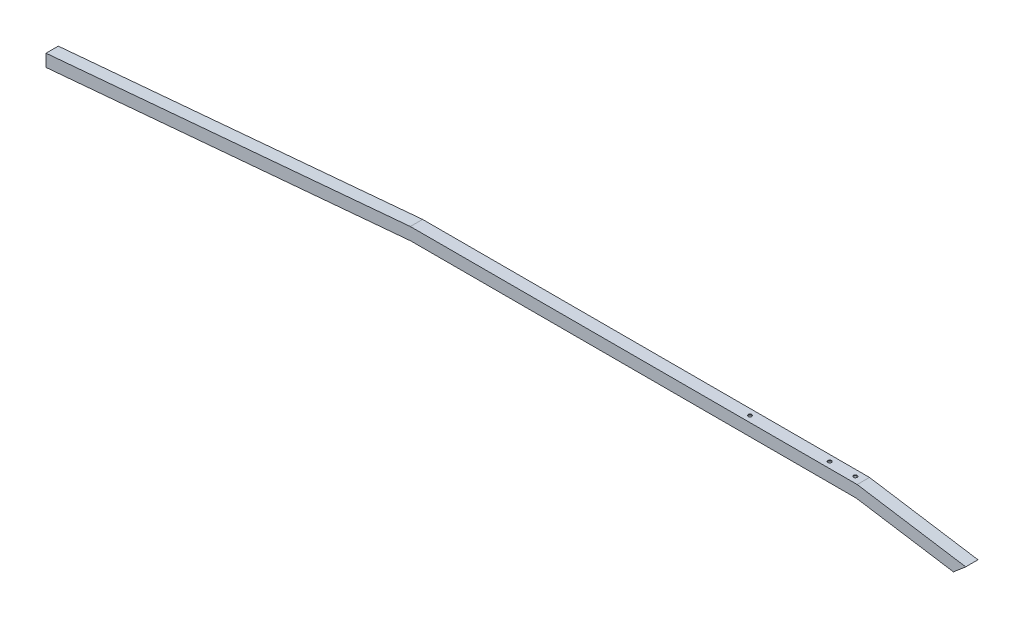
ISO-10303-21;
HEADER;
FILE_DESCRIPTION(('STEP AP214'),'2;1');
FILE_NAME('part.step','',(''),(''),'','','');
FILE_SCHEMA(('AUTOMOTIVE_DESIGN { 1 0 10303 214 1 1 1 1 }'));
ENDSEC;
DATA;
#1=APPLICATION_CONTEXT('core data for automotive mechanical design processes');
#2=APPLICATION_PROTOCOL_DEFINITION('international standard','automotive_design',2000,#1);
#3=PRODUCT_CONTEXT('',#1,'mechanical');
#4=PRODUCT('Part','Part','',(#3));
#5=PRODUCT_RELATED_PRODUCT_CATEGORY('part','',(#4));
#6=PRODUCT_DEFINITION_FORMATION('','',#4);
#7=PRODUCT_DEFINITION_CONTEXT('part definition',#1,'design');
#8=PRODUCT_DEFINITION('design','',#6,#7);
#9=PRODUCT_DEFINITION_SHAPE('','',#8);
#10=(LENGTH_UNIT() NAMED_UNIT(*) SI_UNIT(.MILLI.,.METRE.));
#11=(NAMED_UNIT(*) PLANE_ANGLE_UNIT() SI_UNIT($,.RADIAN.));
#12=(NAMED_UNIT(*) SI_UNIT($,.STERADIAN.) SOLID_ANGLE_UNIT());
#13=UNCERTAINTY_MEASURE_WITH_UNIT(LENGTH_MEASURE(1.E-05),#10,'distance_accuracy_value','');
#14=(GEOMETRIC_REPRESENTATION_CONTEXT(3) GLOBAL_UNCERTAINTY_ASSIGNED_CONTEXT((#13)) GLOBAL_UNIT_ASSIGNED_CONTEXT((#10,
#11,#12)) REPRESENTATION_CONTEXT('',''));
#15=CARTESIAN_POINT('',(0.,0.,0.));
#16=DIRECTION('',(0.,0.,1.));
#17=DIRECTION('',(1.,0.,0.));
#18=AXIS2_PLACEMENT_3D('',#15,#16,#17);
#19=CARTESIAN_POINT('',(0.,0.,-1.651));
#20=DIRECTION('',(0.,0.,-1.));
#21=DIRECTION('',(-1.,0.,0.));
#22=AXIS2_PLACEMENT_3D('',#19,#20,#21);
#23=PLANE('',#22);
#24=DIRECTION('',(-0.987869503710143,0.155286327921928,0.));
#25=VECTOR('',#24,1.);
#26=CARTESIAN_POINT('',(1885.49818551755,76.3667036237448,-1.651));
#27=LINE('',#26,#25);
#28=CARTESIAN_POINT('',(2113.01887833384,40.6020071926856,-1.651));
#29=VERTEX_POINT('',#28);
#30=CARTESIAN_POINT('',(1885.37077889561,76.3867310731194,-1.651));
#31=VERTEX_POINT('',#30);
#32=EDGE_CURVE('E428',#29,#31,#27,.T.);
#33=ORIENTED_EDGE('',*,*,#32,.T.);
#34=DIRECTION('',(-1.,0.,0.));
#35=VECTOR('',#34,1.);
#36=CARTESIAN_POINT('',(848.876766402868,76.3867310731194,-1.651));
#37=LINE('',#36,#35);
#38=CARTESIAN_POINT('',(848.804662659476,76.3867310731194,-1.651));
#39=VERTEX_POINT('',#38);
#40=EDGE_CURVE('E419',#31,#39,#37,.T.);
#41=ORIENTED_EDGE('',*,*,#40,.T.);
#42=DIRECTION('',(-0.996148926897728,-0.0876773370974782,0.));
#43=VECTOR('',#42,1.);
#44=CARTESIAN_POINT('',(847.242528202121,76.2492377870146,-1.651));
#45=LINE('',#44,#43);
#46=CARTESIAN_POINT('',(847.242528202121,76.2492377870146,-1.651));
#47=VERTEX_POINT('',#46);
#48=EDGE_CURVE('E193',#39,#47,#45,.T.);
#49=ORIENTED_EDGE('',*,*,#48,.T.);
#50=DIRECTION('',(-0.996146800530288,-0.0877014925373072,0.));
#51=VECTOR('',#50,1.);
#52=CARTESIAN_POINT('',(847.242528202121,76.2492377870146,-1.651));
#53=LINE('',#52,#51);
#54=CARTESIAN_POINT('',(0.,1.65738623978023,-1.651));
#55=VERTEX_POINT('',#54);
#56=EDGE_CURVE('E191',#47,#55,#53,.T.);
#57=ORIENTED_EDGE('',*,*,#56,.T.);
#58=DIRECTION('',(0.,1.,0.));
#59=VECTOR('',#58,1.);
#60=CARTESIAN_POINT('',(0.,28.6855310731194,-1.651));
#61=LINE('',#60,#59);
#62=CARTESIAN_POINT('',(0.,27.0281448333392,-1.651));
#63=VERTEX_POINT('',#62);
#64=EDGE_CURVE('E9',#55,#63,#61,.T.);
#65=ORIENTED_EDGE('',*,*,#64,.T.);
#66=DIRECTION('',(0.996146800530287,0.0877014925373134,0.));
#67=VECTOR('',#66,1.);
#68=CARTESIAN_POINT('',(0.382685900216284,27.0618367797512,-1.651));
#69=LINE('',#68,#67);
#70=CARTESIAN_POINT('',(847.693849903717,101.659731073119,-1.651));
#71=VERTEX_POINT('',#70);
#72=EDGE_CURVE('E198',#63,#71,#69,.T.);
#73=ORIENTED_EDGE('',*,*,#72,.T.);
#74=DIRECTION('',(1.,0.,0.));
#75=VECTOR('',#74,1.);
#76=CARTESIAN_POINT('',(847.693849903717,101.659731073119,-1.651));
#77=LINE('',#76,#75);
#78=CARTESIAN_POINT('',(1887.34502889454,101.659731073119,-1.651));
#79=VERTEX_POINT('',#78);
#80=EDGE_CURVE('E423',#71,#79,#77,.T.);
#81=ORIENTED_EDGE('',*,*,#80,.T.);
#82=DIRECTION('',(0.987869503710094,-0.155286327922236,0.));
#83=VECTOR('',#82,1.);
#84=CARTESIAN_POINT('',(1887.34502889454,101.659731073119,-1.651));
#85=LINE('',#84,#83);
#86=CARTESIAN_POINT('',(2138.29856329405,62.2115522502588,-1.651));
#87=VERTEX_POINT('',#86);
#88=EDGE_CURVE('E30',#79,#87,#85,.T.);
#89=ORIENTED_EDGE('',*,*,#88,.T.);
#90=DIRECTION('',(0.760128891971908,0.649772319808684,0.));
#91=VECTOR('',#90,1.);
#92=CARTESIAN_POINT('',(872.071398984402,-1020.18298721248,-1.651));
#93=LINE('',#92,#91);
#94=EDGE_CURVE('E23',#29,#87,#93,.T.);
#95=ORIENTED_EDGE('',*,*,#94,.F.);
#96=EDGE_LOOP('',(#33,#41,#49,#57,#65,#73,#81,#89,#95));
#97=FACE_BOUND('',#96,.T.);
#98=ADVANCED_FACE('F15',(#97),#23,.T.);
#99=CARTESIAN_POINT('',(2.50607014925375,0.220636247966421,-28.575));
#100=DIRECTION('',(-0.0877014925373127,0.996146800530287,0.));
#101=DIRECTION('',(-0.996146800530287,-0.0877014925373127,0.));
#102=AXIS2_PLACEMENT_3D('',#99,#100,#101);
#103=PLANE('',#102);
#104=DIRECTION('',(-0.996146800530287,-0.0877014925373127,0.));
#105=VECTOR('',#104,1.);
#106=CARTESIAN_POINT('',(2.50607014925375,0.220636247966421,0.));
#107=LINE('',#106,#105);
#108=CARTESIAN_POINT('',(848.876766402868,74.7357310731194,0.));
#109=VERTEX_POINT('',#108);
#110=CARTESIAN_POINT('',(0.,0.,0.));
#111=VERTEX_POINT('',#110);
#112=EDGE_CURVE('E229',#109,#111,#107,.T.);
#113=ORIENTED_EDGE('',*,*,#112,.T.);
#114=DIRECTION('',(0.,0.,1.));
#115=VECTOR('',#114,1.);
#116=CARTESIAN_POINT('',(0.,0.,-28.575));
#117=LINE('',#116,#115);
#118=CARTESIAN_POINT('',(0.,0.,-28.575));
#119=VERTEX_POINT('',#118);
#120=EDGE_CURVE('E226',#119,#111,#117,.T.);
#121=ORIENTED_EDGE('',*,*,#120,.F.);
#122=DIRECTION('',(-0.996146800530287,-0.0877014925373135,0.));
#123=VECTOR('',#122,1.);
#124=CARTESIAN_POINT('',(13.2669580464314,1.16803268502449,-28.575));
#125=LINE('',#124,#123);
#126=CARTESIAN_POINT('',(848.876766402868,74.7357310731194,-28.575));
#127=VERTEX_POINT('',#126);
#128=EDGE_CURVE('E224',#127,#119,#125,.T.);
#129=ORIENTED_EDGE('',*,*,#128,.F.);
#130=DIRECTION('',(0.,0.,1.));
#131=VECTOR('',#130,1.);
#132=CARTESIAN_POINT('',(848.876766402868,74.7357310731194,-28.575));
#133=LINE('',#132,#131);
#134=EDGE_CURVE('E254',#127,#109,#133,.T.);
#135=ORIENTED_EDGE('',*,*,#134,.T.);
#136=EDGE_LOOP('',(#113,#121,#129,#135));
#137=FACE_BOUND('',#136,.T.);
#138=DIRECTION('',(-0.996146800530287,-0.0877014925373135,0.));
#139=VECTOR('',#138,1.);
#140=CARTESIAN_POINT('',(697.506781254888,61.4090069238654,-19.3972620537415));
#141=LINE('',#140,#139);
#142=CARTESIAN_POINT('',(697.506781254888,61.4090069238651,-19.3972620537415));
#143=VERTEX_POINT('',#142);
#144=CARTESIAN_POINT('',(685.235248819155,60.3286122372982,-19.3972620537415));
#145=VERTEX_POINT('',#144);
#146=EDGE_CURVE('E38',#143,#145,#141,.T.);
#147=ORIENTED_EDGE('',*,*,#146,.T.);
#148=CARTESIAN_POINT('',(685.235248819155,60.3286122372982,-13.4917620537415));
#149=DIRECTION('',(-0.0877014925373135,0.996146800530287,0.));
#150=DIRECTION('',(0.996146800530287,0.0877014925373135,0.));
#151=AXIS2_PLACEMENT_3D('',#148,#149,#150);
#152=CIRCLE('',#151,5.9055);
#153=CARTESIAN_POINT('',(685.235248819155,60.3286122372982,-7.58626205374153));
#154=VERTEX_POINT('',#153);
#155=EDGE_CURVE('E333',#145,#154,#152,.T.);
#156=ORIENTED_EDGE('',*,*,#155,.T.);
#157=DIRECTION('',(0.996146800530287,0.0877014925373135,0.));
#158=VECTOR('',#157,1.);
#159=CARTESIAN_POINT('',(685.235248819155,60.3286122372982,-7.58626205374153));
#160=LINE('',#159,#158);
#161=CARTESIAN_POINT('',(697.506781254888,61.4090069238654,-7.58626205374153));
#162=VERTEX_POINT('',#161);
#163=EDGE_CURVE('E337',#154,#162,#160,.T.);
#164=ORIENTED_EDGE('',*,*,#163,.T.);
#165=CARTESIAN_POINT('',(697.506781254888,61.4090069238654,-13.4917620537415));
#166=DIRECTION('',(-0.0877014925373135,0.996146800530287,0.));
#167=DIRECTION('',(-0.996146800530287,-0.0877014925373135,0.));
#168=AXIS2_PLACEMENT_3D('',#165,#166,#167);
#169=CIRCLE('',#168,5.9055);
#170=EDGE_CURVE('E341',#162,#143,#169,.T.);
#171=ORIENTED_EDGE('',*,*,#170,.T.);
#172=EDGE_LOOP('',(#147,#156,#164,#171));
#173=FACE_BOUND('',#172,.T.);
#174=ADVANCED_FACE('F482',(#137,#173),#103,.F.);
#175=CARTESIAN_POINT('',(847.242528202121,76.2492377870146,-26.9835241074831));
#176=DIRECTION('',(-0.0877014925373072,0.996146800530288,0.));
#177=DIRECTION('',(-0.996146800530288,-0.0877014925373072,0.));
#178=AXIS2_PLACEMENT_3D('',#175,#176,#177);
#179=PLANE('',#178);
#180=ORIENTED_EDGE('',*,*,#56,.F.);
#181=DIRECTION('',(0.,0.,1.));
#182=VECTOR('',#181,1.);
#183=CARTESIAN_POINT('',(847.242528202121,76.2492377870146,-26.9835241074831));
#184=LINE('',#183,#182);
#185=CARTESIAN_POINT('',(847.242528202121,76.2492377870146,-26.9835241074831));
#186=VERTEX_POINT('',#185);
#187=EDGE_CURVE('E204',#186,#47,#184,.T.);
#188=ORIENTED_EDGE('',*,*,#187,.F.);
#189=DIRECTION('',(-0.996146800530288,-0.0877014925373072,0.));
#190=VECTOR('',#189,1.);
#191=CARTESIAN_POINT('',(847.242528202121,76.2492377870146,-26.9835241074831));
#192=LINE('',#191,#190);
#193=CARTESIAN_POINT('',(0.,1.65738623978023,-26.9835241074831));
#194=VERTEX_POINT('',#193);
#195=EDGE_CURVE('E202',#186,#194,#192,.T.);
#196=ORIENTED_EDGE('',*,*,#195,.T.);
#197=DIRECTION('',(0.,0.,1.));
#198=VECTOR('',#197,1.);
#199=CARTESIAN_POINT('',(0.,1.65738623978023,-26.9835241074831));
#200=LINE('',#199,#198);
#201=EDGE_CURVE('E187',#194,#55,#200,.T.);
#202=ORIENTED_EDGE('',*,*,#201,.T.);
#203=EDGE_LOOP('',(#180,#188,#196,#202));
#204=FACE_BOUND('',#203,.T.);
#205=CARTESIAN_POINT('',(685.090453654976,61.9732506049697,-13.4917620537415));
#206=DIRECTION('',(-0.0877014925373072,0.996146800530288,0.));
#207=DIRECTION('',(-0.996146800530288,-0.0877014925373072,0.));
#208=AXIS2_PLACEMENT_3D('',#205,#206,#207);
#209=CIRCLE('',#208,5.9055);
#210=CARTESIAN_POINT('',(685.090453654976,61.9732506049697,-7.58626205374153));
#211=VERTEX_POINT('',#210);
#212=CARTESIAN_POINT('',(685.090453654977,61.9732506049698,-19.3972620537415));
#213=VERTEX_POINT('',#212);
#214=EDGE_CURVE('E304',#211,#213,#209,.F.);
#215=ORIENTED_EDGE('',*,*,#214,.T.);
#216=DIRECTION('',(0.996146800530288,0.0877014925373072,0.));
#217=VECTOR('',#216,1.);
#218=CARTESIAN_POINT('',(847.242528202121,76.2492377870146,-19.3972620537415));
#219=LINE('',#218,#217);
#220=CARTESIAN_POINT('',(697.361986090709,63.0536452915368,-19.3972620537415));
#221=VERTEX_POINT('',#220);
#222=EDGE_CURVE('E307',#213,#221,#219,.T.);
#223=ORIENTED_EDGE('',*,*,#222,.T.);
#224=CARTESIAN_POINT('',(697.361986090709,63.0536452915368,-13.4917620537415));
#225=DIRECTION('',(-0.0877014925373072,0.996146800530288,0.));
#226=DIRECTION('',(-0.996146800530288,-0.0877014925373072,0.));
#227=AXIS2_PLACEMENT_3D('',#224,#225,#226);
#228=CIRCLE('',#227,5.9055);
#229=CARTESIAN_POINT('',(697.361986090709,63.0536452915368,-7.58626205374153));
#230=VERTEX_POINT('',#229);
#231=EDGE_CURVE('E298',#221,#230,#228,.F.);
#232=ORIENTED_EDGE('',*,*,#231,.T.);
#233=DIRECTION('',(-0.996146800530288,-0.0877014925373072,0.));
#234=VECTOR('',#233,1.);
#235=CARTESIAN_POINT('',(847.242528202121,76.2492377870146,-7.58626205374152));
#236=LINE('',#235,#234);
#237=EDGE_CURVE('E301',#230,#211,#236,.T.);
#238=ORIENTED_EDGE('',*,*,#237,.T.);
#239=EDGE_LOOP('',(#215,#223,#232,#238));
#240=FACE_BOUND('',#239,.T.);
#241=ADVANCED_FACE('F200',(#204,#240),#179,.T.);
#242=CARTESIAN_POINT('',(848.876766402868,74.7357310731194,-28.575));
#243=DIRECTION('',(0.,1.,0.));
#244=DIRECTION('',(-1.,0.,0.));
#245=AXIS2_PLACEMENT_3D('',#242,#243,#244);
#246=PLANE('',#245);
#247=CARTESIAN_POINT('',(1623.695,74.7357310731194,-14.2875));
#248=DIRECTION('',(0.,1.,0.));
#249=DIRECTION('',(-1.,0.,0.));
#250=AXIS2_PLACEMENT_3D('',#247,#248,#249);
#251=CIRCLE('',#250,4.19100000000006);
#252=CARTESIAN_POINT('',(1619.504,74.7357310731194,-14.2875));
#253=VERTEX_POINT('',#252);
#254=EDGE_CURVE('E385',#253,#253,#251,.F.);
#255=ORIENTED_EDGE('',*,*,#254,.F.);
#256=EDGE_LOOP('',(#255));
#257=FACE_BOUND('',#256,.T.);
#258=CARTESIAN_POINT('',(1809.115,74.7357310731194,-14.2875));
#259=DIRECTION('',(0.,1.,0.));
#260=DIRECTION('',(-1.,0.,0.));
#261=AXIS2_PLACEMENT_3D('',#258,#259,#260);
#262=CIRCLE('',#261,4.19100000000006);
#263=CARTESIAN_POINT('',(1804.924,74.7357310731194,-14.2875));
#264=VERTEX_POINT('',#263);
#265=EDGE_CURVE('E401',#264,#264,#262,.F.);
#266=ORIENTED_EDGE('',*,*,#265,.F.);
#267=EDGE_LOOP('',(#266));
#268=FACE_BOUND('',#267,.T.);
#269=DIRECTION('',(-1.,0.,0.));
#270=VECTOR('',#269,1.);
#271=CARTESIAN_POINT('',(848.876766402868,74.7357310731194,0.));
#272=LINE('',#271,#270);
#273=CARTESIAN_POINT('',(1885.24180779015,74.7357310731194,0.));
#274=VERTEX_POINT('',#273);
#275=EDGE_CURVE('E243',#274,#109,#272,.T.);
#276=ORIENTED_EDGE('',*,*,#275,.T.);
#277=ORIENTED_EDGE('',*,*,#134,.F.);
#278=DIRECTION('',(-1.,0.,0.));
#279=VECTOR('',#278,1.);
#280=CARTESIAN_POINT('',(848.876766402868,74.7357310731194,-28.575));
#281=LINE('',#280,#279);
#282=CARTESIAN_POINT('',(1885.24180779015,74.7357310731194,-28.575));
#283=VERTEX_POINT('',#282);
#284=EDGE_CURVE('E222',#283,#127,#281,.T.);
#285=ORIENTED_EDGE('',*,*,#284,.F.);
#286=DIRECTION('',(0.,0.,1.));
#287=VECTOR('',#286,1.);
#288=CARTESIAN_POINT('',(1885.24180779015,74.7357310731194,-28.575));
#289=LINE('',#288,#287);
#290=EDGE_CURVE('E257',#283,#274,#289,.T.);
#291=ORIENTED_EDGE('',*,*,#290,.T.);
#292=EDGE_LOOP('',(#276,#277,#285,#291));
#293=FACE_BOUND('',#292,.T.);
#294=CARTESIAN_POINT('',(1868.805,74.7357310731194,-14.2875));
#295=DIRECTION('',(0.,1.,0.));
#296=DIRECTION('',(-1.,0.,0.));
#297=AXIS2_PLACEMENT_3D('',#294,#295,#296);
#298=CIRCLE('',#297,4.19100000000006);
#299=CARTESIAN_POINT('',(1864.614,74.7357310731194,-14.2875));
#300=VERTEX_POINT('',#299);
#301=EDGE_CURVE('E393',#300,#300,#298,.F.);
#302=ORIENTED_EDGE('',*,*,#301,.F.);
#303=EDGE_LOOP('',(#302));
#304=FACE_BOUND('',#303,.T.);
#305=CARTESIAN_POINT('',(1568.12280779015,74.7357310731194,-14.2875000000628));
#306=DIRECTION('',(0.,1.,0.));
#307=DIRECTION('',(-1.,0.,0.));
#308=AXIS2_PLACEMENT_3D('',#305,#306,#307);
#309=CIRCLE('',#308,5.96899999993722);
#310=CARTESIAN_POINT('',(1568.12280779015,74.7357310731194,-8.31850000012556));
#311=VERTEX_POINT('',#310);
#312=CARTESIAN_POINT('',(1568.12280779015,74.7357310731194,-20.2565));
#313=VERTEX_POINT('',#312);
#314=EDGE_CURVE('E355',#311,#313,#309,.T.);
#315=ORIENTED_EDGE('',*,*,#314,.T.);
#316=DIRECTION('',(-0.999986610499443,0.,0.0051748257782583));
#317=VECTOR('',#316,1.);
#318=CARTESIAN_POINT('',(1555.8367478561,74.7357310731194,-20.1929209281767));
#319=LINE('',#318,#317);
#320=CARTESIAN_POINT('',(1555.83670934456,74.7357310731194,-20.1929207288835));
#321=VERTEX_POINT('',#320);
#322=EDGE_CURVE('E359',#313,#321,#319,.T.);
#323=ORIENTED_EDGE('',*,*,#322,.T.);
#324=CARTESIAN_POINT('',(1555.86730779015,74.7357310731194,-14.2875000001256));
#325=DIRECTION('',(0.,1.,0.));
#326=DIRECTION('',(1.,0.,0.));
#327=AXIS2_PLACEMENT_3D('',#324,#325,#326);
#328=CIRCLE('',#327,5.90549999987442);
#329=CARTESIAN_POINT('',(1555.86730779015,74.7357310731194,-8.38200000025115));
#330=VERTEX_POINT('',#329);
#331=EDGE_CURVE('E363',#321,#330,#328,.T.);
#332=ORIENTED_EDGE('',*,*,#331,.T.);
#333=DIRECTION('',(0.999986577091068,0.,0.00518127761175473));
#334=VECTOR('',#333,1.);
#335=CARTESIAN_POINT('',(1555.86730779015,74.7357310731194,-8.38200000025115));
#336=LINE('',#335,#334);
#337=EDGE_CURVE('E367',#330,#311,#336,.T.);
#338=ORIENTED_EDGE('',*,*,#337,.T.);
#339=EDGE_LOOP('',(#315,#323,#332,#338));
#340=FACE_BOUND('',#339,.T.);
#341=ADVANCED_FACE('F495',(#257,#268,#293,#304,#340),#246,.F.);
#342=CARTESIAN_POINT('',(848.876766402868,76.3867310731194,-26.9835241074831));
#343=DIRECTION('',(0.,1.,0.));
#344=DIRECTION('',(0.,0.,1.));
#345=AXIS2_PLACEMENT_3D('',#342,#343,#344);
#346=PLANE('',#345);
#347=CARTESIAN_POINT('',(1623.695,76.3867310731194,-14.2875));
#348=DIRECTION('',(0.,1.,0.));
#349=DIRECTION('',(0.,0.,1.));
#350=AXIS2_PLACEMENT_3D('',#347,#348,#349);
#351=CIRCLE('',#350,4.19100000000006);
#352=CARTESIAN_POINT('',(1623.695,76.3867310731194,-10.0964999999999));
#353=VERTEX_POINT('',#352);
#354=EDGE_CURVE('E282',#353,#353,#351,.F.);
#355=ORIENTED_EDGE('',*,*,#354,.T.);
#356=EDGE_LOOP('',(#355));
#357=FACE_BOUND('',#356,.T.);
#358=CARTESIAN_POINT('',(1809.115,76.3867310731194,-14.2875));
#359=DIRECTION('',(0.,1.,0.));
#360=DIRECTION('',(0.,0.,1.));
#361=AXIS2_PLACEMENT_3D('',#358,#359,#360);
#362=CIRCLE('',#361,4.19100000000006);
#363=CARTESIAN_POINT('',(1809.115,76.3867310731194,-10.0964999999999));
#364=VERTEX_POINT('',#363);
#365=EDGE_CURVE('E272',#364,#364,#362,.F.);
#366=ORIENTED_EDGE('',*,*,#365,.T.);
#367=EDGE_LOOP('',(#366));
#368=FACE_BOUND('',#367,.T.);
#369=ORIENTED_EDGE('',*,*,#40,.F.);
#370=DIRECTION('',(0.,0.,1.));
#371=VECTOR('',#370,1.);
#372=CARTESIAN_POINT('',(1885.37077889561,76.3867310731194,-26.9835241074831));
#373=LINE('',#372,#371);
#374=CARTESIAN_POINT('',(1885.37077889561,76.3867310731194,-26.9835241074831));
#375=VERTEX_POINT('',#374);
#376=EDGE_CURVE('E437',#375,#31,#373,.T.);
#377=ORIENTED_EDGE('',*,*,#376,.F.);
#378=DIRECTION('',(-1.,0.,0.));
#379=VECTOR('',#378,1.);
#380=CARTESIAN_POINT('',(1885.24180779015,76.3867310731194,-26.9835241074831));
#381=LINE('',#380,#379);
#382=CARTESIAN_POINT('',(848.804662659476,76.3867310731194,-26.9835241074831));
#383=VERTEX_POINT('',#382);
#384=EDGE_CURVE('E415',#375,#383,#381,.T.);
#385=ORIENTED_EDGE('',*,*,#384,.T.);
#386=DIRECTION('',(0.,0.,1.));
#387=VECTOR('',#386,1.);
#388=CARTESIAN_POINT('',(848.804662659476,76.3867310731194,-26.9835241074831));
#389=LINE('',#388,#387);
#390=EDGE_CURVE('E417',#383,#39,#389,.T.);
#391=ORIENTED_EDGE('',*,*,#390,.T.);
#392=EDGE_LOOP('',(#369,#377,#385,#391));
#393=FACE_BOUND('',#392,.T.);
#394=CARTESIAN_POINT('',(1868.805,76.3867310731194,-14.2875));
#395=DIRECTION('',(0.,1.,0.));
#396=DIRECTION('',(0.,0.,1.));
#397=AXIS2_PLACEMENT_3D('',#394,#395,#396);
#398=CIRCLE('',#397,4.19100000000006);
#399=CARTESIAN_POINT('',(1868.805,76.3867310731194,-10.0964999999999));
#400=VERTEX_POINT('',#399);
#401=EDGE_CURVE('E277',#400,#400,#398,.F.);
#402=ORIENTED_EDGE('',*,*,#401,.T.);
#403=EDGE_LOOP('',(#402));
#404=FACE_BOUND('',#403,.T.);
#405=DIRECTION('',(0.999986610499443,0.,-0.0051748257782583));
#406=VECTOR('',#405,1.);
#407=CARTESIAN_POINT('',(848.930837676128,76.3867310731194,-16.5347570203866));
#408=LINE('',#407,#406);
#409=CARTESIAN_POINT('',(1555.83670934456,76.3867310731194,-20.1929207288835));
#410=VERTEX_POINT('',#409);
#411=CARTESIAN_POINT('',(1568.12280779015,76.3867310731194,-20.2565));
#412=VERTEX_POINT('',#411);
#413=EDGE_CURVE('E292',#410,#412,#408,.T.);
#414=ORIENTED_EDGE('',*,*,#413,.T.);
#415=CARTESIAN_POINT('',(1568.12280779015,76.3867310731194,-14.2875000000628));
#416=DIRECTION('',(0.,1.,0.));
#417=DIRECTION('',(0.,0.,1.));
#418=AXIS2_PLACEMENT_3D('',#415,#416,#417);
#419=CIRCLE('',#418,5.96899999993722);
#420=CARTESIAN_POINT('',(1568.12280779015,76.3867310731194,-8.31850000012557));
#421=VERTEX_POINT('',#420);
#422=EDGE_CURVE('E295',#412,#421,#419,.F.);
#423=ORIENTED_EDGE('',*,*,#422,.T.);
#424=DIRECTION('',(-0.999986577091068,0.,-0.00518127761175473));
#425=VECTOR('',#424,1.);
#426=CARTESIAN_POINT('',(848.799367648086,76.3867310731194,-12.0455644641909));
#427=LINE('',#426,#425);
#428=CARTESIAN_POINT('',(1555.86730779015,76.3867310731194,-8.38200000025115));
#429=VERTEX_POINT('',#428);
#430=EDGE_CURVE('E271',#421,#429,#427,.T.);
#431=ORIENTED_EDGE('',*,*,#430,.T.);
#432=CARTESIAN_POINT('',(1555.86730779015,76.3867310731194,-14.2875000001256));
#433=DIRECTION('',(0.,1.,0.));
#434=DIRECTION('',(0.,0.,1.));
#435=AXIS2_PLACEMENT_3D('',#432,#433,#434);
#436=CIRCLE('',#435,5.90549999987442);
#437=EDGE_CURVE('E289',#429,#410,#436,.F.);
#438=ORIENTED_EDGE('',*,*,#437,.T.);
#439=EDGE_LOOP('',(#414,#423,#431,#438));
#440=FACE_BOUND('',#439,.T.);
#441=ADVANCED_FACE('F461',(#357,#368,#393,#404,#440),#346,.T.);
#442=CARTESIAN_POINT('',(847.621312571221,103.310731073119,-28.575));
#443=DIRECTION('',(0.,-1.,0.));
#444=DIRECTION('',(0.,0.,-1.));
#445=AXIS2_PLACEMENT_3D('',#442,#443,#444);
#446=PLANE('',#445);
#447=CARTESIAN_POINT('',(1868.805,103.310731073119,-14.2875));
#448=DIRECTION('',(0.,-1.,0.));
#449=DIRECTION('',(-1.,0.,0.));
#450=AXIS2_PLACEMENT_3D('',#447,#448,#449);
#451=CIRCLE('',#450,4.19100000000006);
#452=CARTESIAN_POINT('',(1864.614,103.310731073119,-14.2875));
#453=VERTEX_POINT('',#452);
#454=EDGE_CURVE('E281',#453,#453,#451,.T.);
#455=ORIENTED_EDGE('',*,*,#454,.T.);
#456=EDGE_LOOP('',(#455));
#457=FACE_BOUND('',#456,.T.);
#458=DIRECTION('',(1.,0.,0.));
#459=VECTOR('',#458,1.);
#460=CARTESIAN_POINT('',(847.621312571221,103.310731073119,0.));
#461=LINE('',#460,#459);
#462=CARTESIAN_POINT('',(847.621312571221,103.310731073119,0.));
#463=VERTEX_POINT('',#462);
#464=CARTESIAN_POINT('',(1887.474,103.310731073119,0.));
#465=VERTEX_POINT('',#464);
#466=EDGE_CURVE('E233',#463,#465,#461,.T.);
#467=ORIENTED_EDGE('',*,*,#466,.T.);
#468=DIRECTION('',(0.,0.,1.));
#469=VECTOR('',#468,1.);
#470=CARTESIAN_POINT('',(1887.474,103.310731073119,-28.575));
#471=LINE('',#470,#469);
#472=CARTESIAN_POINT('',(1887.474,103.310731073119,-28.575));
#473=VERTEX_POINT('',#472);
#474=EDGE_CURVE('E262',#473,#465,#471,.T.);
#475=ORIENTED_EDGE('',*,*,#474,.F.);
#476=DIRECTION('',(1.,0.,0.));
#477=VECTOR('',#476,1.);
#478=CARTESIAN_POINT('',(847.621312571221,103.310731073119,-28.575));
#479=LINE('',#478,#477);
#480=CARTESIAN_POINT('',(847.621312571221,103.310731073119,-28.575));
#481=VERTEX_POINT('',#480);
#482=EDGE_CURVE('E214',#481,#473,#479,.T.);
#483=ORIENTED_EDGE('',*,*,#482,.F.);
#484=DIRECTION('',(0.,0.,1.));
#485=VECTOR('',#484,1.);
#486=CARTESIAN_POINT('',(847.621312571221,103.310731073119,-28.575));
#487=LINE('',#486,#485);
#488=EDGE_CURVE('E265',#481,#463,#487,.T.);
#489=ORIENTED_EDGE('',*,*,#488,.T.);
#490=EDGE_LOOP('',(#467,#475,#483,#489));
#491=FACE_BOUND('',#490,.T.);
#492=CARTESIAN_POINT('',(1809.115,103.310731073119,-14.2875));
#493=DIRECTION('',(0.,-1.,0.));
#494=DIRECTION('',(-1.,0.,0.));
#495=AXIS2_PLACEMENT_3D('',#492,#493,#494);
#496=CIRCLE('',#495,4.19100000000006);
#497=CARTESIAN_POINT('',(1804.924,103.310731073119,-14.2875));
#498=VERTEX_POINT('',#497);
#499=EDGE_CURVE('E276',#498,#498,#496,.T.);
#500=ORIENTED_EDGE('',*,*,#499,.T.);
#501=EDGE_LOOP('',(#500));
#502=FACE_BOUND('',#501,.T.);
#503=CARTESIAN_POINT('',(1623.695,103.310731073119,-14.2875));
#504=DIRECTION('',(0.,-1.,0.));
#505=DIRECTION('',(-1.,0.,0.));
#506=AXIS2_PLACEMENT_3D('',#503,#504,#505);
#507=CIRCLE('',#506,4.19100000000006);
#508=CARTESIAN_POINT('',(1619.504,103.310731073119,-14.2875));
#509=VERTEX_POINT('',#508);
#510=EDGE_CURVE('E286',#509,#509,#507,.T.);
#511=ORIENTED_EDGE('',*,*,#510,.T.);
#512=EDGE_LOOP('',(#511));
#513=FACE_BOUND('',#512,.T.);
#514=ADVANCED_FACE('F494',(#457,#491,#502,#513),#446,.F.);
#515=CARTESIAN_POINT('',(847.693849903717,101.659731073119,-26.9835241074831));
#516=DIRECTION('',(0.,-1.,0.));
#517=DIRECTION('',(1.,0.,0.));
#518=AXIS2_PLACEMENT_3D('',#515,#516,#517);
#519=PLANE('',#518);
#520=CARTESIAN_POINT('',(1868.805,101.659731073119,-14.2875));
#521=DIRECTION('',(0.,-1.,0.));
#522=DIRECTION('',(1.,0.,0.));
#523=AXIS2_PLACEMENT_3D('',#520,#521,#522);
#524=CIRCLE('',#523,4.19100000000006);
#525=CARTESIAN_POINT('',(1872.996,101.659731073119,-14.2875));
#526=VERTEX_POINT('',#525);
#527=EDGE_CURVE('E280',#526,#526,#524,.F.);
#528=ORIENTED_EDGE('',*,*,#527,.T.);
#529=EDGE_LOOP('',(#528));
#530=FACE_BOUND('',#529,.T.);
#531=ORIENTED_EDGE('',*,*,#80,.F.);
#532=DIRECTION('',(0.,0.,1.));
#533=VECTOR('',#532,1.);
#534=CARTESIAN_POINT('',(847.693849903717,101.659731073119,-26.9835241074831));
#535=LINE('',#534,#533);
#536=CARTESIAN_POINT('',(847.693849903717,101.659731073119,-26.9835241074831));
#537=VERTEX_POINT('',#536);
#538=EDGE_CURVE('E208',#537,#71,#535,.T.);
#539=ORIENTED_EDGE('',*,*,#538,.F.);
#540=DIRECTION('',(1.,0.,0.));
#541=VECTOR('',#540,1.);
#542=CARTESIAN_POINT('',(847.693849903717,101.659731073119,-26.9835241074831));
#543=LINE('',#542,#541);
#544=CARTESIAN_POINT('',(1887.34502889454,101.659731073119,-26.9835241074831));
#545=VERTEX_POINT('',#544);
#546=EDGE_CURVE('E410',#537,#545,#543,.T.);
#547=ORIENTED_EDGE('',*,*,#546,.T.);
#548=DIRECTION('',(0.,0.,1.));
#549=VECTOR('',#548,1.);
#550=CARTESIAN_POINT('',(1887.34502889454,101.659731073119,-26.9835241074831));
#551=LINE('',#550,#549);
#552=EDGE_CURVE('E440',#545,#79,#551,.T.);
#553=ORIENTED_EDGE('',*,*,#552,.T.);
#554=EDGE_LOOP('',(#531,#539,#547,#553));
#555=FACE_BOUND('',#554,.T.);
#556=CARTESIAN_POINT('',(1809.115,101.659731073119,-14.2875));
#557=DIRECTION('',(0.,-1.,0.));
#558=DIRECTION('',(1.,0.,0.));
#559=AXIS2_PLACEMENT_3D('',#556,#557,#558);
#560=CIRCLE('',#559,4.19100000000006);
#561=CARTESIAN_POINT('',(1813.306,101.659731073119,-14.2875));
#562=VERTEX_POINT('',#561);
#563=EDGE_CURVE('E275',#562,#562,#560,.F.);
#564=ORIENTED_EDGE('',*,*,#563,.T.);
#565=EDGE_LOOP('',(#564));
#566=FACE_BOUND('',#565,.T.);
#567=CARTESIAN_POINT('',(1623.695,101.659731073119,-14.2875));
#568=DIRECTION('',(0.,-1.,0.));
#569=DIRECTION('',(1.,0.,0.));
#570=AXIS2_PLACEMENT_3D('',#567,#568,#569);
#571=CIRCLE('',#570,4.19100000000006);
#572=CARTESIAN_POINT('',(1627.886,101.659731073119,-14.2875));
#573=VERTEX_POINT('',#572);
#574=EDGE_CURVE('E285',#573,#573,#571,.F.);
#575=ORIENTED_EDGE('',*,*,#574,.T.);
#576=EDGE_LOOP('',(#575));
#577=FACE_BOUND('',#576,.T.);
#578=ADVANCED_FACE('F450',(#530,#555,#566,#577),#519,.T.);
#579=CARTESIAN_POINT('',(0.,28.6855310731194,-28.575));
#580=DIRECTION('',(1.,0.,0.));
#581=DIRECTION('',(0.,1.,0.));
#582=AXIS2_PLACEMENT_3D('',#579,#580,#581);
#583=PLANE('',#582);
#584=DIRECTION('',(0.,0.,1.));
#585=VECTOR('',#584,1.);
#586=CARTESIAN_POINT('',(0.,27.0281448333392,-26.9835241074831));
#587=LINE('',#586,#585);
#588=CARTESIAN_POINT('',(0.,27.0281448333392,-26.9835241074831));
#589=VERTEX_POINT('',#588);
#590=EDGE_CURVE('E188',#589,#63,#587,.T.);
#591=ORIENTED_EDGE('',*,*,#590,.T.);
#592=ORIENTED_EDGE('',*,*,#64,.F.);
#593=ORIENTED_EDGE('',*,*,#201,.F.);
#594=DIRECTION('',(0.,1.,0.));
#595=VECTOR('',#594,1.);
#596=CARTESIAN_POINT('',(0.,27.0281448333392,-26.9835241074831));
#597=LINE('',#596,#595);
#598=EDGE_CURVE('E405',#194,#589,#597,.T.);
#599=ORIENTED_EDGE('',*,*,#598,.T.);
#600=EDGE_LOOP('',(#591,#592,#593,#599));
#601=FACE_BOUND('',#600,.T.);
#602=DIRECTION('',(0.,1.,0.));
#603=VECTOR('',#602,1.);
#604=CARTESIAN_POINT('',(0.,28.6855310731194,0.));
#605=LINE('',#604,#603);
#606=CARTESIAN_POINT('',(0.,28.6855310731194,0.));
#607=VERTEX_POINT('',#606);
#608=EDGE_CURVE('E206',#111,#607,#605,.T.);
#609=ORIENTED_EDGE('',*,*,#608,.T.);
#610=DIRECTION('',(0.,0.,1.));
#611=VECTOR('',#610,1.);
#612=CARTESIAN_POINT('',(0.,28.6855310731194,-28.575));
#613=LINE('',#612,#611);
#614=CARTESIAN_POINT('',(0.,28.6855310731194,-28.575));
#615=VERTEX_POINT('',#614);
#616=EDGE_CURVE('E268',#615,#607,#613,.T.);
#617=ORIENTED_EDGE('',*,*,#616,.F.);
#618=DIRECTION('',(0.,1.,0.));
#619=VECTOR('',#618,1.);
#620=CARTESIAN_POINT('',(0.,28.6855310731194,-28.575));
#621=LINE('',#620,#619);
#622=EDGE_CURVE('E215',#119,#615,#621,.T.);
#623=ORIENTED_EDGE('',*,*,#622,.F.);
#624=ORIENTED_EDGE('',*,*,#120,.T.);
#625=EDGE_LOOP('',(#609,#617,#623,#624));
#626=FACE_BOUND('',#625,.T.);
#627=ADVANCED_FACE('F17',(#601,#626),#583,.F.);
#628=CARTESIAN_POINT('',(0.,28.6855310731194,-28.575));
#629=DIRECTION('',(0.0877014925373134,-0.996146800530287,0.));
#630=DIRECTION('',(0.996146800530287,0.0877014925373134,0.));
#631=AXIS2_PLACEMENT_3D('',#628,#629,#630);
#632=PLANE('',#631);
#633=DIRECTION('',(0.996146800530287,0.0877014925373134,0.));
#634=VECTOR('',#633,1.);
#635=CARTESIAN_POINT('',(0.,28.6855310731194,0.));
#636=LINE('',#635,#634);
#637=EDGE_CURVE('E230',#607,#463,#636,.T.);
#638=ORIENTED_EDGE('',*,*,#637,.T.);
#639=ORIENTED_EDGE('',*,*,#488,.F.);
#640=DIRECTION('',(0.996146800530287,0.0877014925373134,0.));
#641=VECTOR('',#640,1.);
#642=CARTESIAN_POINT('',(0.,28.6855310731194,-28.575));
#643=LINE('',#642,#641);
#644=EDGE_CURVE('E212',#615,#481,#643,.T.);
#645=ORIENTED_EDGE('',*,*,#644,.F.);
#646=ORIENTED_EDGE('',*,*,#616,.T.);
#647=EDGE_LOOP('',(#638,#639,#645,#646));
#648=FACE_BOUND('',#647,.T.);
#649=ADVANCED_FACE('F521',(#648),#632,.F.);
#650=CARTESIAN_POINT('',(1887.474,103.310731073119,-28.575));
#651=DIRECTION('',(-0.155286327922236,-0.987869503710094,0.));
#652=DIRECTION('',(0.987869503710094,-0.155286327922236,0.));
#653=AXIS2_PLACEMENT_3D('',#650,#651,#652);
#654=PLANE('',#653);
#655=DIRECTION('',(0.987869503710094,-0.155286327922236,0.));
#656=VECTOR('',#655,1.);
#657=CARTESIAN_POINT('',(1887.474,103.310731073119,0.));
#658=LINE('',#657,#656);
#659=CARTESIAN_POINT('',(2139.95,63.6232310731194,0.));
#660=VERTEX_POINT('',#659);
#661=EDGE_CURVE('E236',#465,#660,#658,.T.);
#662=ORIENTED_EDGE('',*,*,#661,.T.);
#663=DIRECTION('',(0.,0.,1.));
#664=VECTOR('',#663,1.);
#665=CARTESIAN_POINT('',(2139.95,63.6232310731194,-28.575));
#666=LINE('',#665,#664);
#667=CARTESIAN_POINT('',(2139.95,63.6232310731194,-28.575));
#668=VERTEX_POINT('',#667);
#669=EDGE_CURVE('E260',#668,#660,#666,.T.);
#670=ORIENTED_EDGE('',*,*,#669,.F.);
#671=DIRECTION('',(0.987869503710094,-0.155286327922236,0.));
#672=VECTOR('',#671,1.);
#673=CARTESIAN_POINT('',(1887.474,103.310731073119,-28.575));
#674=LINE('',#673,#672);
#675=EDGE_CURVE('E217',#473,#668,#674,.T.);
#676=ORIENTED_EDGE('',*,*,#675,.F.);
#677=ORIENTED_EDGE('',*,*,#474,.T.);
#678=EDGE_LOOP('',(#662,#670,#676,#677));
#679=FACE_BOUND('',#678,.T.);
#680=ADVANCED_FACE('F517',(#679),#654,.F.);
#681=CARTESIAN_POINT('',(1885.24180779015,74.7357310731194,-28.575));
#682=DIRECTION('',(0.155286327922236,0.987869503710094,0.));
#683=DIRECTION('',(-0.987869503710094,0.155286327922236,0.));
#684=AXIS2_PLACEMENT_3D('',#681,#682,#683);
#685=PLANE('',#684);
#686=DIRECTION('',(-0.987869503710094,0.155286327922236,0.));
#687=VECTOR('',#686,1.);
#688=CARTESIAN_POINT('',(1885.24180779015,74.7357310731194,-28.575));
#689=LINE('',#688,#687);
#690=CARTESIAN_POINT('',(2111.36744162782,39.1903283697637,-28.575));
#691=VERTEX_POINT('',#690);
#692=EDGE_CURVE('E220',#691,#283,#689,.T.);
#693=ORIENTED_EDGE('',*,*,#692,.F.);
#694=DIRECTION('',(0.,0.,1.));
#695=VECTOR('',#694,1.);
#696=CARTESIAN_POINT('',(2111.36744162782,39.1903283697637,-38.4489150383472));
#697=LINE('',#696,#695);
#698=CARTESIAN_POINT('',(2111.36744162782,39.1903283697637,0.));
#699=VERTEX_POINT('',#698);
#700=EDGE_CURVE('E328',#691,#699,#697,.T.);
#701=ORIENTED_EDGE('',*,*,#700,.T.);
#702=DIRECTION('',(-0.987869503710094,0.155286327922236,0.));
#703=VECTOR('',#702,1.);
#704=CARTESIAN_POINT('',(1885.24180779015,74.7357310731194,0.));
#705=LINE('',#704,#703);
#706=EDGE_CURVE('E240',#699,#274,#705,.T.);
#707=ORIENTED_EDGE('',*,*,#706,.T.);
#708=ORIENTED_EDGE('',*,*,#290,.F.);
#709=EDGE_LOOP('',(#693,#701,#707,#708));
#710=FACE_BOUND('',#709,.T.);
#711=ADVANCED_FACE('F514',(#710),#685,.F.);
#712=CARTESIAN_POINT('',(0.,0.,-28.575));
#713=DIRECTION('',(0.,0.,-1.));
#714=DIRECTION('',(-1.,0.,0.));
#715=AXIS2_PLACEMENT_3D('',#712,#713,#714);
#716=PLANE('',#715);
#717=DIRECTION('',(0.760128891971908,0.649772319808684,0.));
#718=VECTOR('',#717,1.);
#719=CARTESIAN_POINT('',(872.071398984402,-1020.18298721248,-28.575));
#720=LINE('',#719,#718);
#721=EDGE_CURVE('E326',#691,#668,#720,.T.);
#722=ORIENTED_EDGE('',*,*,#721,.F.);
#723=ORIENTED_EDGE('',*,*,#692,.T.);
#724=ORIENTED_EDGE('',*,*,#284,.T.);
#725=ORIENTED_EDGE('',*,*,#128,.T.);
#726=ORIENTED_EDGE('',*,*,#622,.T.);
#727=ORIENTED_EDGE('',*,*,#644,.T.);
#728=ORIENTED_EDGE('',*,*,#482,.T.);
#729=ORIENTED_EDGE('',*,*,#675,.T.);
#730=EDGE_LOOP('',(#722,#723,#724,#725,#726,#727,#728,#729));
#731=FACE_BOUND('',#730,.T.);
#732=ADVANCED_FACE('F476',(#731),#716,.T.);
#733=CARTESIAN_POINT('',(0.,0.,0.));
#734=DIRECTION('',(0.,0.,-1.));
#735=DIRECTION('',(-1.,0.,0.));
#736=AXIS2_PLACEMENT_3D('',#733,#734,#735);
#737=PLANE('',#736);
#738=ORIENTED_EDGE('',*,*,#706,.F.);
#739=DIRECTION('',(-0.760128891971908,-0.649772319808684,0.));
#740=VECTOR('',#739,1.);
#741=CARTESIAN_POINT('',(2111.36744162782,39.1903283697637,0.));
#742=LINE('',#741,#740);
#743=EDGE_CURVE('E541',#660,#699,#742,.T.);
#744=ORIENTED_EDGE('',*,*,#743,.F.);
#745=ORIENTED_EDGE('',*,*,#661,.F.);
#746=ORIENTED_EDGE('',*,*,#466,.F.);
#747=ORIENTED_EDGE('',*,*,#637,.F.);
#748=ORIENTED_EDGE('',*,*,#608,.F.);
#749=ORIENTED_EDGE('',*,*,#112,.F.);
#750=ORIENTED_EDGE('',*,*,#275,.F.);
#751=EDGE_LOOP('',(#738,#744,#745,#746,#747,#748,#749,#750));
#752=FACE_BOUND('',#751,.T.);
#753=ADVANCED_FACE('F468',(#752),#737,.F.);
#754=CARTESIAN_POINT('',(847.242528202121,76.2492377870146,-26.9835241074831));
#755=DIRECTION('',(-0.0876773370974782,0.996148926897728,0.));
#756=DIRECTION('',(-0.996148926897728,-0.0876773370974782,0.));
#757=AXIS2_PLACEMENT_3D('',#754,#755,#756);
#758=PLANE('',#757);
#759=ORIENTED_EDGE('',*,*,#48,.F.);
#760=ORIENTED_EDGE('',*,*,#390,.F.);
#761=DIRECTION('',(-0.996148926897728,-0.0876773370974782,0.));
#762=VECTOR('',#761,1.);
#763=CARTESIAN_POINT('',(847.242528202121,76.2492377870146,-26.9835241074831));
#764=LINE('',#763,#762);
#765=EDGE_CURVE('E406',#383,#186,#764,.T.);
#766=ORIENTED_EDGE('',*,*,#765,.T.);
#767=ORIENTED_EDGE('',*,*,#187,.T.);
#768=EDGE_LOOP('',(#759,#760,#766,#767));
#769=FACE_BOUND('',#768,.T.);
#770=ADVANCED_FACE('F466',(#769),#758,.T.);
#771=CARTESIAN_POINT('',(0.382685900216284,27.0618367797512,-26.9835241074831));
#772=DIRECTION('',(0.0877014925373134,-0.996146800530287,0.));
#773=DIRECTION('',(0.996146800530287,0.0877014925373134,0.));
#774=AXIS2_PLACEMENT_3D('',#771,#772,#773);
#775=PLANE('',#774);
#776=ORIENTED_EDGE('',*,*,#72,.F.);
#777=ORIENTED_EDGE('',*,*,#590,.F.);
#778=DIRECTION('',(0.996146800530287,0.0877014925373152,0.));
#779=VECTOR('',#778,1.);
#780=CARTESIAN_POINT('',(0.14479516417909,27.0408927054439,-26.9835241074831));
#781=LINE('',#780,#779);
#782=EDGE_CURVE('E408',#589,#537,#781,.T.);
#783=ORIENTED_EDGE('',*,*,#782,.T.);
#784=ORIENTED_EDGE('',*,*,#538,.T.);
#785=EDGE_LOOP('',(#776,#777,#783,#784));
#786=FACE_BOUND('',#785,.T.);
#787=ADVANCED_FACE('F446',(#786),#775,.T.);
#788=CARTESIAN_POINT('',(1887.34502889454,101.659731073119,-26.9835241074831));
#789=DIRECTION('',(-0.155286327922236,-0.987869503710094,0.));
#790=DIRECTION('',(0.987869503710094,-0.155286327922236,0.));
#791=AXIS2_PLACEMENT_3D('',#788,#789,#790);
#792=PLANE('',#791);
#793=DIRECTION('',(0.,0.,-1.));
#794=VECTOR('',#793,1.);
#795=CARTESIAN_POINT('',(2138.29856329405,62.2115522502588,-26.9835241074831));
#796=LINE('',#795,#794);
#797=CARTESIAN_POINT('',(2138.29856329405,62.2115522502588,-26.9835241074831));
#798=VERTEX_POINT('',#797);
#799=EDGE_CURVE('E313',#87,#798,#796,.T.);
#800=ORIENTED_EDGE('',*,*,#799,.F.);
#801=ORIENTED_EDGE('',*,*,#88,.F.);
#802=ORIENTED_EDGE('',*,*,#552,.F.);
#803=DIRECTION('',(0.987869503710094,-0.155286327922236,0.));
#804=VECTOR('',#803,1.);
#805=CARTESIAN_POINT('',(1887.34502889454,101.659731073119,-26.9835241074831));
#806=LINE('',#805,#804);
#807=EDGE_CURVE('E323',#545,#798,#806,.T.);
#808=ORIENTED_EDGE('',*,*,#807,.T.);
#809=EDGE_LOOP('',(#800,#801,#802,#808));
#810=FACE_BOUND('',#809,.T.);
#811=ADVANCED_FACE('F320',(#810),#792,.T.);
#812=CARTESIAN_POINT('',(1885.49818551755,76.3667036237448,-26.9835241074831));
#813=DIRECTION('',(0.155286327921928,0.987869503710143,0.));
#814=DIRECTION('',(-0.987869503710143,0.155286327921928,0.));
#815=AXIS2_PLACEMENT_3D('',#812,#813,#814);
#816=PLANE('',#815);
#817=DIRECTION('',(0.,0.,1.));
#818=VECTOR('',#817,1.);
#819=CARTESIAN_POINT('',(2113.01887833384,40.6020071926856,-26.9835241074831));
#820=LINE('',#819,#818);
#821=CARTESIAN_POINT('',(2113.01887833384,40.6020071926856,-26.9835241074831));
#822=VERTEX_POINT('',#821);
#823=EDGE_CURVE('E316',#822,#29,#820,.T.);
#824=ORIENTED_EDGE('',*,*,#823,.F.);
#825=DIRECTION('',(-0.987869503710089,0.155286327922268,0.));
#826=VECTOR('',#825,1.);
#827=CARTESIAN_POINT('',(2115.20978565369,40.2576115500313,-26.9835241074831));
#828=LINE('',#827,#826);
#829=EDGE_CURVE('E413',#822,#375,#828,.T.);
#830=ORIENTED_EDGE('',*,*,#829,.T.);
#831=ORIENTED_EDGE('',*,*,#376,.T.);
#832=ORIENTED_EDGE('',*,*,#32,.F.);
#833=EDGE_LOOP('',(#824,#830,#831,#832));
#834=FACE_BOUND('',#833,.T.);
#835=ADVANCED_FACE('F457',(#834),#816,.T.);
#836=CARTESIAN_POINT('',(0.,0.,-26.9835241074831));
#837=DIRECTION('',(0.,0.,-1.));
#838=DIRECTION('',(-1.,0.,0.));
#839=AXIS2_PLACEMENT_3D('',#836,#837,#838);
#840=PLANE('',#839);
#841=ORIENTED_EDGE('',*,*,#829,.F.);
#842=DIRECTION('',(0.760128891971908,0.649772319808684,0.));
#843=VECTOR('',#842,1.);
#844=CARTESIAN_POINT('',(872.071398984402,-1020.18298721248,-26.9835241074831));
#845=LINE('',#844,#843);
#846=EDGE_CURVE('E324',#822,#798,#845,.T.);
#847=ORIENTED_EDGE('',*,*,#846,.T.);
#848=ORIENTED_EDGE('',*,*,#807,.F.);
#849=ORIENTED_EDGE('',*,*,#546,.F.);
#850=ORIENTED_EDGE('',*,*,#782,.F.);
#851=ORIENTED_EDGE('',*,*,#598,.F.);
#852=ORIENTED_EDGE('',*,*,#195,.F.);
#853=ORIENTED_EDGE('',*,*,#765,.F.);
#854=ORIENTED_EDGE('',*,*,#384,.F.);
#855=EDGE_LOOP('',(#841,#847,#848,#849,#850,#851,#852,#853,#854));
#856=FACE_BOUND('',#855,.T.);
#857=ADVANCED_FACE('F454',(#856),#840,.F.);
#858=CARTESIAN_POINT('',(1809.115,46.326330500191,-14.2875));
#859=DIRECTION('',(0.,1.,0.));
#860=DIRECTION('',(0.,0.,1.));
#861=AXIS2_PLACEMENT_3D('',#858,#859,#860);
#862=CYLINDRICAL_SURFACE('',#861,4.19100000000006);
#863=ORIENTED_EDGE('',*,*,#365,.F.);
#864=EDGE_LOOP('',(#863));
#865=FACE_BOUND('',#864,.T.);
#866=ORIENTED_EDGE('',*,*,#265,.T.);
#867=EDGE_LOOP('',(#866));
#868=FACE_BOUND('',#867,.T.);
#869=ADVANCED_FACE('F608',(#865,#868),#862,.F.);
#870=ORIENTED_EDGE('',*,*,#563,.F.);
#871=EDGE_LOOP('',(#870));
#872=FACE_BOUND('',#871,.T.);
#873=ORIENTED_EDGE('',*,*,#499,.F.);
#874=EDGE_LOOP('',(#873));
#875=FACE_BOUND('',#874,.T.);
#876=ADVANCED_FACE('F606',(#872,#875),#862,.F.);
#877=CARTESIAN_POINT('',(1868.805,46.326330500191,-14.2875));
#878=DIRECTION('',(0.,1.,0.));
#879=DIRECTION('',(0.,0.,1.));
#880=AXIS2_PLACEMENT_3D('',#877,#878,#879);
#881=CYLINDRICAL_SURFACE('',#880,4.19100000000006);
#882=ORIENTED_EDGE('',*,*,#401,.F.);
#883=EDGE_LOOP('',(#882));
#884=FACE_BOUND('',#883,.T.);
#885=ORIENTED_EDGE('',*,*,#301,.T.);
#886=EDGE_LOOP('',(#885));
#887=FACE_BOUND('',#886,.T.);
#888=ADVANCED_FACE('F604',(#884,#887),#881,.F.);
#889=ORIENTED_EDGE('',*,*,#527,.F.);
#890=EDGE_LOOP('',(#889));
#891=FACE_BOUND('',#890,.T.);
#892=ORIENTED_EDGE('',*,*,#454,.F.);
#893=EDGE_LOOP('',(#892));
#894=FACE_BOUND('',#893,.T.);
#895=ADVANCED_FACE('F602',(#891,#894),#881,.F.);
#896=CARTESIAN_POINT('',(1623.695,46.326330500191,-14.2875));
#897=DIRECTION('',(0.,1.,0.));
#898=DIRECTION('',(0.,0.,1.));
#899=AXIS2_PLACEMENT_3D('',#896,#897,#898);
#900=CYLINDRICAL_SURFACE('',#899,4.19100000000006);
#901=ORIENTED_EDGE('',*,*,#354,.F.);
#902=EDGE_LOOP('',(#901));
#903=FACE_BOUND('',#902,.T.);
#904=ORIENTED_EDGE('',*,*,#254,.T.);
#905=EDGE_LOOP('',(#904));
#906=FACE_BOUND('',#905,.T.);
#907=ADVANCED_FACE('F599',(#903,#906),#900,.F.);
#908=ORIENTED_EDGE('',*,*,#574,.F.);
#909=EDGE_LOOP('',(#908));
#910=FACE_BOUND('',#909,.T.);
#911=ORIENTED_EDGE('',*,*,#510,.F.);
#912=EDGE_LOOP('',(#911));
#913=FACE_BOUND('',#912,.T.);
#914=ADVANCED_FACE('F597',(#910,#913),#900,.F.);
#915=CARTESIAN_POINT('',(1568.12280779015,87.7021931453856,-14.2875000000628));
#916=DIRECTION('',(0.,-1.,0.));
#917=DIRECTION('',(1.,0.,0.));
#918=AXIS2_PLACEMENT_3D('',#915,#916,#917);
#919=CYLINDRICAL_SURFACE('',#918,5.96899999993722);
#920=DIRECTION('',(0.,-1.,0.));
#921=VECTOR('',#920,1.);
#922=CARTESIAN_POINT('',(1568.12280779015,87.7021931453856,-20.2565));
#923=LINE('',#922,#921);
#924=EDGE_CURVE('E375',#412,#313,#923,.T.);
#925=ORIENTED_EDGE('',*,*,#924,.T.);
#926=ORIENTED_EDGE('',*,*,#314,.F.);
#927=DIRECTION('',(0.,-1.,0.));
#928=VECTOR('',#927,1.);
#929=CARTESIAN_POINT('',(1568.12280779015,87.7021931453856,-8.31850000012557));
#930=LINE('',#929,#928);
#931=EDGE_CURVE('E377',#421,#311,#930,.T.);
#932=ORIENTED_EDGE('',*,*,#931,.F.);
#933=ORIENTED_EDGE('',*,*,#422,.F.);
#934=EDGE_LOOP('',(#925,#926,#932,#933));
#935=FACE_BOUND('',#934,.T.);
#936=ADVANCED_FACE('F593',(#935),#919,.F.);
#937=CARTESIAN_POINT('',(1555.8367478561,87.7021931453856,-20.1929209281767));
#938=DIRECTION('',(0.0051748257782583,0.,0.999986610499443));
#939=DIRECTION('',(0.999986610499443,0.,-0.0051748257782583));
#940=AXIS2_PLACEMENT_3D('',#937,#938,#939);
#941=PLANE('',#940);
#942=DIRECTION('',(0.,-1.,0.));
#943=VECTOR('',#942,1.);
#944=CARTESIAN_POINT('',(1555.83670934456,87.7021931453856,-20.1929207288835));
#945=LINE('',#944,#943);
#946=EDGE_CURVE('E373',#410,#321,#945,.T.);
#947=ORIENTED_EDGE('',*,*,#946,.T.);
#948=ORIENTED_EDGE('',*,*,#322,.F.);
#949=ORIENTED_EDGE('',*,*,#924,.F.);
#950=ORIENTED_EDGE('',*,*,#413,.F.);
#951=EDGE_LOOP('',(#947,#948,#949,#950));
#952=FACE_BOUND('',#951,.T.);
#953=ADVANCED_FACE('F589',(#952),#941,.T.);
#954=CARTESIAN_POINT('',(1555.86730779015,87.7021931453856,-14.2875000001256));
#955=DIRECTION('',(0.,-1.,0.));
#956=DIRECTION('',(1.,0.,0.));
#957=AXIS2_PLACEMENT_3D('',#954,#955,#956);
#958=CYLINDRICAL_SURFACE('',#957,5.90549999987442);
#959=DIRECTION('',(0.,-1.,0.));
#960=VECTOR('',#959,1.);
#961=CARTESIAN_POINT('',(1555.86730779015,87.7021931453856,-8.38200000025115));
#962=LINE('',#961,#960);
#963=EDGE_CURVE('E371',#429,#330,#962,.T.);
#964=ORIENTED_EDGE('',*,*,#963,.T.);
#965=ORIENTED_EDGE('',*,*,#331,.F.);
#966=ORIENTED_EDGE('',*,*,#946,.F.);
#967=ORIENTED_EDGE('',*,*,#437,.F.);
#968=EDGE_LOOP('',(#964,#965,#966,#967));
#969=FACE_BOUND('',#968,.T.);
#970=ADVANCED_FACE('F585',(#969),#958,.F.);
#971=CARTESIAN_POINT('',(1555.86730779015,87.7021931453856,-8.38200000025115));
#972=DIRECTION('',(0.00518127761175473,0.,-0.999986577091068));
#973=DIRECTION('',(-0.999986577091068,0.,-0.00518127761175473));
#974=AXIS2_PLACEMENT_3D('',#971,#972,#973);
#975=PLANE('',#974);
#976=ORIENTED_EDGE('',*,*,#931,.T.);
#977=ORIENTED_EDGE('',*,*,#337,.F.);
#978=ORIENTED_EDGE('',*,*,#963,.F.);
#979=ORIENTED_EDGE('',*,*,#430,.F.);
#980=EDGE_LOOP('',(#976,#977,#978,#979));
#981=FACE_BOUND('',#980,.T.);
#982=ADVANCED_FACE('F582',(#981),#975,.T.);
#983=CARTESIAN_POINT('',(696.962516021992,67.5909777741187,-19.3972620537415));
#984=DIRECTION('',(0.,0.,1.));
#985=DIRECTION('',(1.,0.,0.));
#986=AXIS2_PLACEMENT_3D('',#983,#984,#985);
#987=PLANE('',#986);
#988=DIRECTION('',(0.0877014925373127,-0.996146800530287,0.));
#989=VECTOR('',#988,1.);
#990=CARTESIAN_POINT('',(684.690983586259,66.5105830875516,-19.3972620537415));
#991=LINE('',#990,#989);
#992=EDGE_CURVE('E353',#213,#145,#991,.T.);
#993=ORIENTED_EDGE('',*,*,#992,.T.);
#994=ORIENTED_EDGE('',*,*,#146,.F.);
#995=DIRECTION('',(0.0877014925373127,-0.996146800530287,0.));
#996=VECTOR('',#995,1.);
#997=CARTESIAN_POINT('',(696.962516021992,67.5909777741187,-19.3972620537415));
#998=LINE('',#997,#996);
#999=EDGE_CURVE('E345',#221,#143,#998,.T.);
#1000=ORIENTED_EDGE('',*,*,#999,.F.);
#1001=ORIENTED_EDGE('',*,*,#222,.F.);
#1002=EDGE_LOOP('',(#993,#994,#1000,#1001));
#1003=FACE_BOUND('',#1002,.T.);
#1004=ADVANCED_FACE('F563',(#1003),#987,.T.);
#1005=CARTESIAN_POINT('',(684.690983586259,66.5105830875516,-13.4917620537415));
#1006=DIRECTION('',(0.0877014925373127,-0.996146800530287,0.));
#1007=DIRECTION('',(0.996146800530287,0.0877014925373127,0.));
#1008=AXIS2_PLACEMENT_3D('',#1005,#1006,#1007);
#1009=CYLINDRICAL_SURFACE('',#1008,5.9055);
#1010=DIRECTION('',(0.0877014925373127,-0.996146800530287,0.));
#1011=VECTOR('',#1010,1.);
#1012=CARTESIAN_POINT('',(684.690983586259,66.5105830875516,-7.58626205374153));
#1013=LINE('',#1012,#1011);
#1014=EDGE_CURVE('E351',#211,#154,#1013,.T.);
#1015=ORIENTED_EDGE('',*,*,#1014,.T.);
#1016=ORIENTED_EDGE('',*,*,#155,.F.);
#1017=ORIENTED_EDGE('',*,*,#992,.F.);
#1018=ORIENTED_EDGE('',*,*,#214,.F.);
#1019=EDGE_LOOP('',(#1015,#1016,#1017,#1018));
#1020=FACE_BOUND('',#1019,.T.);
#1021=ADVANCED_FACE('F567',(#1020),#1009,.F.);
#1022=CARTESIAN_POINT('',(684.690983586259,66.5105830875516,-7.58626205374153));
#1023=DIRECTION('',(0.,0.,-1.));
#1024=DIRECTION('',(-1.,0.,0.));
#1025=AXIS2_PLACEMENT_3D('',#1022,#1023,#1024);
#1026=PLANE('',#1025);
#1027=DIRECTION('',(0.0877014925373127,-0.996146800530287,0.));
#1028=VECTOR('',#1027,1.);
#1029=CARTESIAN_POINT('',(696.962516021991,67.5909777741187,-7.58626205374153));
#1030=LINE('',#1029,#1028);
#1031=EDGE_CURVE('E349',#230,#162,#1030,.T.);
#1032=ORIENTED_EDGE('',*,*,#1031,.T.);
#1033=ORIENTED_EDGE('',*,*,#163,.F.);
#1034=ORIENTED_EDGE('',*,*,#1014,.F.);
#1035=ORIENTED_EDGE('',*,*,#237,.F.);
#1036=EDGE_LOOP('',(#1032,#1033,#1034,#1035));
#1037=FACE_BOUND('',#1036,.T.);
#1038=ADVANCED_FACE('F569',(#1037),#1026,.T.);
#1039=CARTESIAN_POINT('',(696.962516021992,67.5909777741187,-13.4917620537415));
#1040=DIRECTION('',(0.0877014925373127,-0.996146800530287,0.));
#1041=DIRECTION('',(0.996146800530287,0.0877014925373127,0.));
#1042=AXIS2_PLACEMENT_3D('',#1039,#1040,#1041);
#1043=CYLINDRICAL_SURFACE('',#1042,5.9055);
#1044=ORIENTED_EDGE('',*,*,#999,.T.);
#1045=ORIENTED_EDGE('',*,*,#170,.F.);
#1046=ORIENTED_EDGE('',*,*,#1031,.F.);
#1047=ORIENTED_EDGE('',*,*,#231,.F.);
#1048=EDGE_LOOP('',(#1044,#1045,#1046,#1047));
#1049=FACE_BOUND('',#1048,.T.);
#1050=ADVANCED_FACE('F561',(#1049),#1043,.F.);
#1051=CARTESIAN_POINT('',(2111.36744162782,39.1903283697637,-38.4489150383472));
#1052=DIRECTION('',(-0.649772319808684,0.760128891971908,0.));
#1053=DIRECTION('',(-0.760128891971908,-0.649772319808684,0.));
#1054=AXIS2_PLACEMENT_3D('',#1051,#1052,#1053);
#1055=PLANE('',#1054);
#1056=ORIENTED_EDGE('',*,*,#823,.T.);
#1057=ORIENTED_EDGE('',*,*,#94,.T.);
#1058=ORIENTED_EDGE('',*,*,#799,.T.);
#1059=ORIENTED_EDGE('',*,*,#846,.F.);
#1060=EDGE_LOOP('',(#1056,#1057,#1058,#1059));
#1061=FACE_BOUND('',#1060,.T.);
#1062=ORIENTED_EDGE('',*,*,#721,.T.);
#1063=ORIENTED_EDGE('',*,*,#669,.T.);
#1064=ORIENTED_EDGE('',*,*,#743,.T.);
#1065=ORIENTED_EDGE('',*,*,#700,.F.);
#1066=EDGE_LOOP('',(#1062,#1063,#1064,#1065));
#1067=FACE_BOUND('',#1066,.T.);
#1068=ADVANCED_FACE('F311',(#1061,#1067),#1055,.F.);
#1069=CLOSED_SHELL('',(#98,#174,#241,#341,#441,#514,#578,#627,#649,#680,#711,#732,#753,#770,
#787,#811,#835,#857,#869,#876,#888,#895,#907,#914,#936,#953,#970,#982,#1004,#1021,#1038,#1050,#1068));
#1070=MANIFOLD_SOLID_BREP('B1',#1069);
#1071=ADVANCED_BREP_SHAPE_REPRESENTATION('',(#18,#1070),#14);
#1072=SHAPE_DEFINITION_REPRESENTATION(#9,#1071);
ENDSEC;
END-ISO-10303-21;
